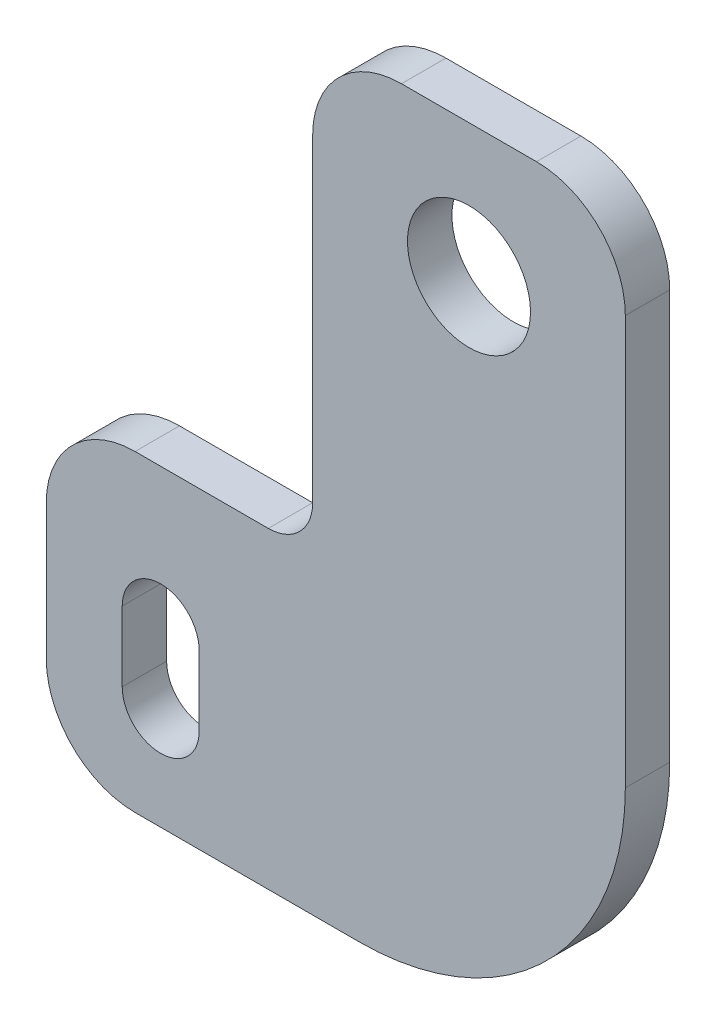
ISO-10303-21;
HEADER;
FILE_DESCRIPTION(('STEP AP214'),'2;1');
FILE_NAME('part.step','',(''),(''),'','','');
FILE_SCHEMA(('AUTOMOTIVE_DESIGN { 1 0 10303 214 1 1 1 1 }'));
ENDSEC;
DATA;
#1=APPLICATION_CONTEXT('core data for automotive mechanical design processes');
#2=APPLICATION_PROTOCOL_DEFINITION('international standard','automotive_design',2000,#1);
#3=PRODUCT_CONTEXT('',#1,'mechanical');
#4=PRODUCT('Part','Part','',(#3));
#5=PRODUCT_RELATED_PRODUCT_CATEGORY('part','',(#4));
#6=PRODUCT_DEFINITION_FORMATION('','',#4);
#7=PRODUCT_DEFINITION_CONTEXT('part definition',#1,'design');
#8=PRODUCT_DEFINITION('design','',#6,#7);
#9=PRODUCT_DEFINITION_SHAPE('','',#8);
#10=(LENGTH_UNIT() NAMED_UNIT(*) SI_UNIT(.MILLI.,.METRE.));
#11=(NAMED_UNIT(*) PLANE_ANGLE_UNIT() SI_UNIT($,.RADIAN.));
#12=(NAMED_UNIT(*) SI_UNIT($,.STERADIAN.) SOLID_ANGLE_UNIT());
#13=UNCERTAINTY_MEASURE_WITH_UNIT(LENGTH_MEASURE(1.E-05),#10,'distance_accuracy_value','');
#14=(GEOMETRIC_REPRESENTATION_CONTEXT(3) GLOBAL_UNCERTAINTY_ASSIGNED_CONTEXT((#13)) GLOBAL_UNIT_ASSIGNED_CONTEXT((#10,
#11,#12)) REPRESENTATION_CONTEXT('',''));
#15=CARTESIAN_POINT('',(0.,0.,0.));
#16=DIRECTION('',(0.,0.,1.));
#17=DIRECTION('',(1.,0.,0.));
#18=AXIS2_PLACEMENT_3D('',#15,#16,#17);
#19=CARTESIAN_POINT('',(0.,0.,-3.175));
#20=DIRECTION('',(-1.,0.,0.));
#21=DIRECTION('',(0.,0.,1.));
#22=AXIS2_PLACEMENT_3D('',#19,#20,#21);
#23=PLANE('',#22);
#24=DIRECTION('',(0.,-1.,0.));
#25=VECTOR('',#24,1.);
#26=CARTESIAN_POINT('',(0.,0.,-3.175));
#27=LINE('',#26,#25);
#28=CARTESIAN_POINT('',(0.,16.002,-3.175));
#29=VERTEX_POINT('',#28);
#30=CARTESIAN_POINT('',(0.,6.35,-3.175));
#31=VERTEX_POINT('',#30);
#32=EDGE_CURVE('E193',#29,#31,#27,.T.);
#33=ORIENTED_EDGE('',*,*,#32,.T.);
#34=DIRECTION('',(0.,0.,1.));
#35=VECTOR('',#34,1.);
#36=CARTESIAN_POINT('',(0.,6.35,-3.175));
#37=LINE('',#36,#35);
#38=CARTESIAN_POINT('',(0.,6.35,0.));
#39=VERTEX_POINT('',#38);
#40=EDGE_CURVE('E226',#31,#39,#37,.T.);
#41=ORIENTED_EDGE('',*,*,#40,.T.);
#42=DIRECTION('',(0.,-1.,0.));
#43=VECTOR('',#42,1.);
#44=CARTESIAN_POINT('',(0.,0.,0.));
#45=LINE('',#44,#43);
#46=CARTESIAN_POINT('',(0.,16.002,0.));
#47=VERTEX_POINT('',#46);
#48=EDGE_CURVE('E184',#47,#39,#45,.T.);
#49=ORIENTED_EDGE('',*,*,#48,.F.);
#50=DIRECTION('',(0.,0.,1.));
#51=VECTOR('',#50,1.);
#52=CARTESIAN_POINT('',(0.,16.002,-3.175));
#53=LINE('',#52,#51);
#54=EDGE_CURVE('E210',#47,#29,#53,.F.);
#55=ORIENTED_EDGE('',*,*,#54,.T.);
#56=EDGE_LOOP('',(#33,#41,#49,#55));
#57=FACE_BOUND('',#56,.T.);
#58=ADVANCED_FACE('F38',(#57),#23,.T.);
#59=CARTESIAN_POINT('',(0.,22.352,-3.175));
#60=DIRECTION('',(0.,1.,0.));
#61=DIRECTION('',(0.,0.,1.));
#62=AXIS2_PLACEMENT_3D('',#59,#60,#61);
#63=PLANE('',#62);
#64=DIRECTION('',(-1.,0.,0.));
#65=VECTOR('',#64,1.);
#66=CARTESIAN_POINT('',(0.,22.352,0.));
#67=LINE('',#66,#65);
#68=CARTESIAN_POINT('',(15.8708409647328,22.352,0.));
#69=VERTEX_POINT('',#68);
#70=CARTESIAN_POINT('',(6.35,22.352,0.));
#71=VERTEX_POINT('',#70);
#72=EDGE_CURVE('E197',#69,#71,#67,.T.);
#73=ORIENTED_EDGE('',*,*,#72,.F.);
#74=DIRECTION('',(0.,0.,1.));
#75=VECTOR('',#74,1.);
#76=CARTESIAN_POINT('',(15.8708409647328,22.352,-3.175));
#77=LINE('',#76,#75);
#78=CARTESIAN_POINT('',(15.8708409647328,22.352,-3.175));
#79=VERTEX_POINT('',#78);
#80=EDGE_CURVE('E274',#69,#79,#77,.F.);
#81=ORIENTED_EDGE('',*,*,#80,.T.);
#82=DIRECTION('',(-1.,0.,0.));
#83=VECTOR('',#82,1.);
#84=CARTESIAN_POINT('',(0.,22.352,-3.175));
#85=LINE('',#84,#83);
#86=CARTESIAN_POINT('',(6.35,22.352,-3.175));
#87=VERTEX_POINT('',#86);
#88=EDGE_CURVE('E208',#79,#87,#85,.T.);
#89=ORIENTED_EDGE('',*,*,#88,.T.);
#90=DIRECTION('',(0.,0.,1.));
#91=VECTOR('',#90,1.);
#92=CARTESIAN_POINT('',(6.35,22.352,-3.175));
#93=LINE('',#92,#91);
#94=EDGE_CURVE('E249',#87,#71,#93,.T.);
#95=ORIENTED_EDGE('',*,*,#94,.T.);
#96=EDGE_LOOP('',(#73,#81,#89,#95));
#97=FACE_BOUND('',#96,.T.);
#98=ADVANCED_FACE('F284',(#97),#63,.T.);
#99=CARTESIAN_POINT('',(19.0458409647328,54.6440071428529,-3.175));
#100=DIRECTION('',(-1.,0.,0.));
#101=DIRECTION('',(0.,-1.,0.));
#102=AXIS2_PLACEMENT_3D('',#99,#100,#101);
#103=PLANE('',#102);
#104=DIRECTION('',(0.,-1.,0.));
#105=VECTOR('',#104,1.);
#106=CARTESIAN_POINT('',(19.0458409647328,54.6440071428529,-3.175));
#107=LINE('',#106,#105);
#108=CARTESIAN_POINT('',(19.0458409647328,48.2940071428529,-3.175));
#109=VERTEX_POINT('',#108);
#110=CARTESIAN_POINT('',(19.0458409647328,25.527,-3.175));
#111=VERTEX_POINT('',#110);
#112=EDGE_CURVE('E205',#109,#111,#107,.T.);
#113=ORIENTED_EDGE('',*,*,#112,.T.);
#114=DIRECTION('',(0.,0.,1.));
#115=VECTOR('',#114,1.);
#116=CARTESIAN_POINT('',(19.0458409647328,25.527,0.));
#117=LINE('',#116,#115);
#118=CARTESIAN_POINT('',(19.0458409647328,25.527,0.));
#119=VERTEX_POINT('',#118);
#120=EDGE_CURVE('E271',#111,#119,#117,.T.);
#121=ORIENTED_EDGE('',*,*,#120,.T.);
#122=DIRECTION('',(0.,-1.,0.));
#123=VECTOR('',#122,1.);
#124=CARTESIAN_POINT('',(19.0458409647328,54.6440071428529,0.));
#125=LINE('',#124,#123);
#126=CARTESIAN_POINT('',(19.0458409647328,48.2940071428529,0.));
#127=VERTEX_POINT('',#126);
#128=EDGE_CURVE('E221',#127,#119,#125,.T.);
#129=ORIENTED_EDGE('',*,*,#128,.F.);
#130=DIRECTION('',(0.,0.,1.));
#131=VECTOR('',#130,1.);
#132=CARTESIAN_POINT('',(19.0458409647328,48.2940071428529,-3.175));
#133=LINE('',#132,#131);
#134=EDGE_CURVE('E257',#127,#109,#133,.F.);
#135=ORIENTED_EDGE('',*,*,#134,.T.);
#136=EDGE_LOOP('',(#113,#121,#129,#135));
#137=FACE_BOUND('',#136,.T.);
#138=ADVANCED_FACE('F293',(#137),#103,.T.);
#139=CARTESIAN_POINT('',(19.0458409647328,54.6440071428529,-3.175));
#140=DIRECTION('',(0.,1.,0.));
#141=DIRECTION('',(0.,0.,1.));
#142=AXIS2_PLACEMENT_3D('',#139,#140,#141);
#143=PLANE('',#142);
#144=DIRECTION('',(-1.,0.,0.));
#145=VECTOR('',#144,1.);
#146=CARTESIAN_POINT('',(19.0458409647328,54.6440071428529,-3.175));
#147=LINE('',#146,#145);
#148=CARTESIAN_POINT('',(35.0478409647328,54.6440071428529,-3.175));
#149=VERTEX_POINT('',#148);
#150=CARTESIAN_POINT('',(25.3958409647328,54.6440071428529,-3.175));
#151=VERTEX_POINT('',#150);
#152=EDGE_CURVE('E202',#149,#151,#147,.T.);
#153=ORIENTED_EDGE('',*,*,#152,.T.);
#154=DIRECTION('',(0.,0.,1.));
#155=VECTOR('',#154,1.);
#156=CARTESIAN_POINT('',(25.3958409647328,54.6440071428529,-3.175));
#157=LINE('',#156,#155);
#158=CARTESIAN_POINT('',(25.3958409647328,54.6440071428529,0.));
#159=VERTEX_POINT('',#158);
#160=EDGE_CURVE('E254',#151,#159,#157,.T.);
#161=ORIENTED_EDGE('',*,*,#160,.T.);
#162=DIRECTION('',(-1.,0.,0.));
#163=VECTOR('',#162,1.);
#164=CARTESIAN_POINT('',(19.0458409647328,54.6440071428529,0.));
#165=LINE('',#164,#163);
#166=CARTESIAN_POINT('',(35.0478409647328,54.6440071428529,0.));
#167=VERTEX_POINT('',#166);
#168=EDGE_CURVE('E218',#167,#159,#165,.T.);
#169=ORIENTED_EDGE('',*,*,#168,.F.);
#170=DIRECTION('',(0.,0.,1.));
#171=VECTOR('',#170,1.);
#172=CARTESIAN_POINT('',(35.0478409647328,54.6440071428529,-3.175));
#173=LINE('',#172,#171);
#174=EDGE_CURVE('E252',#167,#149,#173,.F.);
#175=ORIENTED_EDGE('',*,*,#174,.T.);
#176=EDGE_LOOP('',(#153,#161,#169,#175));
#177=FACE_BOUND('',#176,.T.);
#178=ADVANCED_FACE('F301',(#177),#143,.T.);
#179=CARTESIAN_POINT('',(41.3978409647328,54.6440071428529,-3.175));
#180=DIRECTION('',(1.,0.,0.));
#181=DIRECTION('',(0.,1.,0.));
#182=AXIS2_PLACEMENT_3D('',#179,#180,#181);
#183=PLANE('',#182);
#184=DIRECTION('',(0.,1.,0.));
#185=VECTOR('',#184,1.);
#186=CARTESIAN_POINT('',(41.3978409647328,54.6440071428529,0.));
#187=LINE('',#186,#185);
#188=CARTESIAN_POINT('',(41.3978409647328,19.05,0.));
#189=VERTEX_POINT('',#188);
#190=CARTESIAN_POINT('',(41.3978409647328,48.2940071428529,0.));
#191=VERTEX_POINT('',#190);
#192=EDGE_CURVE('E216',#189,#191,#187,.T.);
#193=ORIENTED_EDGE('',*,*,#192,.F.);
#194=DIRECTION('',(0.,0.,1.));
#195=VECTOR('',#194,1.);
#196=CARTESIAN_POINT('',(41.3978409647328,19.05,-3.175));
#197=LINE('',#196,#195);
#198=CARTESIAN_POINT('',(41.3978409647328,19.05,-3.175));
#199=VERTEX_POINT('',#198);
#200=EDGE_CURVE('E267',#189,#199,#197,.F.);
#201=ORIENTED_EDGE('',*,*,#200,.T.);
#202=DIRECTION('',(0.,1.,0.));
#203=VECTOR('',#202,1.);
#204=CARTESIAN_POINT('',(41.3978409647328,54.6440071428529,-3.175));
#205=LINE('',#204,#203);
#206=CARTESIAN_POINT('',(41.3978409647328,48.2940071428529,-3.175));
#207=VERTEX_POINT('',#206);
#208=EDGE_CURVE('E200',#199,#207,#205,.T.);
#209=ORIENTED_EDGE('',*,*,#208,.T.);
#210=DIRECTION('',(0.,0.,1.));
#211=VECTOR('',#210,1.);
#212=CARTESIAN_POINT('',(41.3978409647328,48.2940071428529,-3.175));
#213=LINE('',#212,#211);
#214=EDGE_CURVE('E259',#207,#191,#213,.T.);
#215=ORIENTED_EDGE('',*,*,#214,.T.);
#216=EDGE_LOOP('',(#193,#201,#209,#215));
#217=FACE_BOUND('',#216,.T.);
#218=ADVANCED_FACE('F348',(#217),#183,.T.);
#219=CARTESIAN_POINT('',(0.,0.,-3.175));
#220=DIRECTION('',(0.,-1.,0.));
#221=DIRECTION('',(0.,0.,-1.));
#222=AXIS2_PLACEMENT_3D('',#219,#220,#221);
#223=PLANE('',#222);
#224=DIRECTION('',(1.,0.,0.));
#225=VECTOR('',#224,1.);
#226=CARTESIAN_POINT('',(0.,0.,-3.175));
#227=LINE('',#226,#225);
#228=CARTESIAN_POINT('',(6.35,0.,-3.175));
#229=VERTEX_POINT('',#228);
#230=CARTESIAN_POINT('',(22.3478409647328,0.,-3.175));
#231=VERTEX_POINT('',#230);
#232=EDGE_CURVE('E196',#229,#231,#227,.T.);
#233=ORIENTED_EDGE('',*,*,#232,.T.);
#234=DIRECTION('',(0.,0.,1.));
#235=VECTOR('',#234,1.);
#236=CARTESIAN_POINT('',(22.3478409647328,0.,-3.175));
#237=LINE('',#236,#235);
#238=CARTESIAN_POINT('',(22.3478409647328,0.,0.));
#239=VERTEX_POINT('',#238);
#240=EDGE_CURVE('E262',#231,#239,#237,.T.);
#241=ORIENTED_EDGE('',*,*,#240,.T.);
#242=DIRECTION('',(1.,0.,0.));
#243=VECTOR('',#242,1.);
#244=CARTESIAN_POINT('',(0.,0.,0.));
#245=LINE('',#244,#243);
#246=CARTESIAN_POINT('',(6.35,0.,0.));
#247=VERTEX_POINT('',#246);
#248=EDGE_CURVE('E213',#247,#239,#245,.T.);
#249=ORIENTED_EDGE('',*,*,#248,.F.);
#250=DIRECTION('',(0.,0.,1.));
#251=VECTOR('',#250,1.);
#252=CARTESIAN_POINT('',(6.35,0.,-3.175));
#253=LINE('',#252,#251);
#254=EDGE_CURVE('E237',#247,#229,#253,.F.);
#255=ORIENTED_EDGE('',*,*,#254,.T.);
#256=EDGE_LOOP('',(#233,#241,#249,#255));
#257=FACE_BOUND('',#256,.T.);
#258=ADVANCED_FACE('F317',(#257),#223,.T.);
#259=CARTESIAN_POINT('',(0.,0.,-3.175));
#260=DIRECTION('',(0.,0.,-1.));
#261=DIRECTION('',(-1.,0.,0.));
#262=AXIS2_PLACEMENT_3D('',#259,#260,#261);
#263=PLANE('',#262);
#264=CARTESIAN_POINT('',(8.18094866968339,12.3250000000768,-3.175));
#265=DIRECTION('',(0.,0.,1.));
#266=DIRECTION('',(1.,0.,0.));
#267=AXIS2_PLACEMENT_3D('',#264,#265,#266);
#268=CIRCLE('',#267,2.75);
#269=CARTESIAN_POINT('',(10.9309486696834,12.3250000000768,-3.175));
#270=VERTEX_POINT('',#269);
#271=CARTESIAN_POINT('',(5.43094866968339,12.3250000000768,-3.175));
#272=VERTEX_POINT('',#271);
#273=EDGE_CURVE('E152',#270,#272,#268,.T.);
#274=ORIENTED_EDGE('',*,*,#273,.T.);
#275=DIRECTION('',(0.,-1.,0.));
#276=VECTOR('',#275,1.);
#277=CARTESIAN_POINT('',(5.43094866968341,7.32500000007682,-3.175));
#278=LINE('',#277,#276);
#279=CARTESIAN_POINT('',(5.43094866968341,7.32500000007682,-3.175));
#280=VERTEX_POINT('',#279);
#281=EDGE_CURVE('E161',#272,#280,#278,.T.);
#282=ORIENTED_EDGE('',*,*,#281,.T.);
#283=CARTESIAN_POINT('',(8.18094866968341,7.32500000007684,-3.175));
#284=DIRECTION('',(0.,0.,1.));
#285=DIRECTION('',(1.,0.,0.));
#286=AXIS2_PLACEMENT_3D('',#283,#284,#285);
#287=CIRCLE('',#286,2.75);
#288=CARTESIAN_POINT('',(10.9309486696834,7.32500000007683,-3.175));
#289=VERTEX_POINT('',#288);
#290=EDGE_CURVE('E53',#280,#289,#287,.T.);
#291=ORIENTED_EDGE('',*,*,#290,.T.);
#292=DIRECTION('',(0.,1.,0.));
#293=VECTOR('',#292,1.);
#294=CARTESIAN_POINT('',(10.9309486696834,12.3250000000768,-3.175));
#295=LINE('',#294,#293);
#296=EDGE_CURVE('E158',#289,#270,#295,.T.);
#297=ORIENTED_EDGE('',*,*,#296,.T.);
#298=EDGE_LOOP('',(#274,#282,#291,#297));
#299=FACE_BOUND('',#298,.T.);
#300=CARTESIAN_POINT('',(30.2218409647509,45.1190071428216,-3.175));
#301=DIRECTION('',(0.,0.,1.));
#302=DIRECTION('',(1.,0.,0.));
#303=AXIS2_PLACEMENT_3D('',#300,#301,#302);
#304=CIRCLE('',#303,4.39687500099185);
#305=CARTESIAN_POINT('',(34.6187159657428,45.1190071428216,-3.175));
#306=VERTEX_POINT('',#305);
#307=EDGE_CURVE('E178',#306,#306,#304,.T.);
#308=ORIENTED_EDGE('',*,*,#307,.T.);
#309=EDGE_LOOP('',(#308));
#310=FACE_BOUND('',#309,.T.);
#311=ORIENTED_EDGE('',*,*,#208,.F.);
#312=CARTESIAN_POINT('',(22.3478409647328,19.05,-3.175));
#313=DIRECTION('',(0.,0.,-1.));
#314=DIRECTION('',(-1.,0.,0.));
#315=AXIS2_PLACEMENT_3D('',#312,#313,#314);
#316=CIRCLE('',#315,19.05);
#317=EDGE_CURVE('E269',#199,#231,#316,.T.);
#318=ORIENTED_EDGE('',*,*,#317,.T.);
#319=ORIENTED_EDGE('',*,*,#232,.F.);
#320=CARTESIAN_POINT('',(6.35,6.35,-3.175));
#321=DIRECTION('',(0.,0.,-1.));
#322=DIRECTION('',(-1.,0.,0.));
#323=AXIS2_PLACEMENT_3D('',#320,#321,#322);
#324=CIRCLE('',#323,6.35);
#325=EDGE_CURVE('E247',#229,#31,#324,.T.);
#326=ORIENTED_EDGE('',*,*,#325,.T.);
#327=ORIENTED_EDGE('',*,*,#32,.F.);
#328=CARTESIAN_POINT('',(6.35,16.002,-3.175));
#329=DIRECTION('',(0.,0.,-1.));
#330=DIRECTION('',(-1.,0.,0.));
#331=AXIS2_PLACEMENT_3D('',#328,#329,#330);
#332=CIRCLE('',#331,6.35);
#333=EDGE_CURVE('E244',#29,#87,#332,.T.);
#334=ORIENTED_EDGE('',*,*,#333,.T.);
#335=ORIENTED_EDGE('',*,*,#88,.F.);
#336=CARTESIAN_POINT('',(15.8708409647328,25.527,-3.175));
#337=DIRECTION('',(0.,0.,-1.));
#338=DIRECTION('',(-1.,0.,0.));
#339=AXIS2_PLACEMENT_3D('',#336,#337,#338);
#340=CIRCLE('',#339,3.175);
#341=EDGE_CURVE('E11',#79,#111,#340,.F.);
#342=ORIENTED_EDGE('',*,*,#341,.T.);
#343=ORIENTED_EDGE('',*,*,#112,.F.);
#344=CARTESIAN_POINT('',(25.3958409647328,48.2940071428529,-3.175));
#345=DIRECTION('',(0.,0.,-1.));
#346=DIRECTION('',(-1.,0.,0.));
#347=AXIS2_PLACEMENT_3D('',#344,#345,#346);
#348=CIRCLE('',#347,6.35);
#349=EDGE_CURVE('E242',#109,#151,#348,.T.);
#350=ORIENTED_EDGE('',*,*,#349,.T.);
#351=ORIENTED_EDGE('',*,*,#152,.F.);
#352=CARTESIAN_POINT('',(35.0478409647328,48.2940071428529,-3.175));
#353=DIRECTION('',(0.,0.,-1.));
#354=DIRECTION('',(-1.,0.,0.));
#355=AXIS2_PLACEMENT_3D('',#352,#353,#354);
#356=CIRCLE('',#355,6.35);
#357=EDGE_CURVE('E239',#149,#207,#356,.T.);
#358=ORIENTED_EDGE('',*,*,#357,.T.);
#359=EDGE_LOOP('',(#311,#318,#319,#326,#327,#334,#335,#342,#343,#350,#351,#358));
#360=FACE_BOUND('',#359,.T.);
#361=ADVANCED_FACE('F165',(#299,#310,#360),#263,.T.);
#362=CARTESIAN_POINT('',(0.,0.,0.));
#363=DIRECTION('',(0.,0.,-1.));
#364=DIRECTION('',(-1.,0.,0.));
#365=AXIS2_PLACEMENT_3D('',#362,#363,#364);
#366=PLANE('',#365);
#367=DIRECTION('',(0.,-1.,0.));
#368=VECTOR('',#367,1.);
#369=CARTESIAN_POINT('',(5.43094866968341,7.32500000007682,0.));
#370=LINE('',#369,#368);
#371=CARTESIAN_POINT('',(5.43094866968339,12.3250000000768,0.));
#372=VERTEX_POINT('',#371);
#373=CARTESIAN_POINT('',(5.43094866968341,7.32500000007682,0.));
#374=VERTEX_POINT('',#373);
#375=EDGE_CURVE('E177',#372,#374,#370,.T.);
#376=ORIENTED_EDGE('',*,*,#375,.F.);
#377=CARTESIAN_POINT('',(8.18094866968339,12.3250000000768,0.));
#378=DIRECTION('',(0.,0.,1.));
#379=DIRECTION('',(1.,0.,0.));
#380=AXIS2_PLACEMENT_3D('',#377,#378,#379);
#381=CIRCLE('',#380,2.75);
#382=CARTESIAN_POINT('',(10.9309486696834,12.3250000000768,0.));
#383=VERTEX_POINT('',#382);
#384=EDGE_CURVE('E61',#383,#372,#381,.T.);
#385=ORIENTED_EDGE('',*,*,#384,.F.);
#386=DIRECTION('',(0.,1.,0.));
#387=VECTOR('',#386,1.);
#388=CARTESIAN_POINT('',(10.9309486696834,12.3250000000768,0.));
#389=LINE('',#388,#387);
#390=CARTESIAN_POINT('',(10.9309486696834,7.32500000007683,0.));
#391=VERTEX_POINT('',#390);
#392=EDGE_CURVE('E168',#391,#383,#389,.T.);
#393=ORIENTED_EDGE('',*,*,#392,.F.);
#394=CARTESIAN_POINT('',(8.18094866968341,7.32500000007684,0.));
#395=DIRECTION('',(0.,0.,1.));
#396=DIRECTION('',(1.,0.,0.));
#397=AXIS2_PLACEMENT_3D('',#394,#395,#396);
#398=CIRCLE('',#397,2.75);
#399=EDGE_CURVE('E171',#374,#391,#398,.T.);
#400=ORIENTED_EDGE('',*,*,#399,.F.);
#401=EDGE_LOOP('',(#376,#385,#393,#400));
#402=FACE_BOUND('',#401,.T.);
#403=CARTESIAN_POINT('',(30.2218409647509,45.1190071428216,0.));
#404=DIRECTION('',(0.,0.,1.));
#405=DIRECTION('',(1.,0.,0.));
#406=AXIS2_PLACEMENT_3D('',#403,#404,#405);
#407=CIRCLE('',#406,4.39687500099185);
#408=CARTESIAN_POINT('',(34.6187159657428,45.1190071428216,0.));
#409=VERTEX_POINT('',#408);
#410=EDGE_CURVE('E190',#409,#409,#407,.T.);
#411=ORIENTED_EDGE('',*,*,#410,.F.);
#412=EDGE_LOOP('',(#411));
#413=FACE_BOUND('',#412,.T.);
#414=ORIENTED_EDGE('',*,*,#248,.T.);
#415=CARTESIAN_POINT('',(22.3478409647328,19.05,0.));
#416=DIRECTION('',(0.,0.,-1.));
#417=DIRECTION('',(-1.,0.,0.));
#418=AXIS2_PLACEMENT_3D('',#415,#416,#417);
#419=CIRCLE('',#418,19.05);
#420=EDGE_CURVE('E265',#239,#189,#419,.F.);
#421=ORIENTED_EDGE('',*,*,#420,.T.);
#422=ORIENTED_EDGE('',*,*,#192,.T.);
#423=CARTESIAN_POINT('',(35.0478409647328,48.2940071428529,0.));
#424=DIRECTION('',(0.,0.,-1.));
#425=DIRECTION('',(-1.,0.,0.));
#426=AXIS2_PLACEMENT_3D('',#423,#424,#425);
#427=CIRCLE('',#426,6.35);
#428=EDGE_CURVE('E229',#191,#167,#427,.F.);
#429=ORIENTED_EDGE('',*,*,#428,.T.);
#430=ORIENTED_EDGE('',*,*,#168,.T.);
#431=CARTESIAN_POINT('',(25.3958409647328,48.2940071428529,0.));
#432=DIRECTION('',(0.,0.,-1.));
#433=DIRECTION('',(-1.,0.,0.));
#434=AXIS2_PLACEMENT_3D('',#431,#432,#433);
#435=CIRCLE('',#434,6.35);
#436=EDGE_CURVE('E231',#159,#127,#435,.F.);
#437=ORIENTED_EDGE('',*,*,#436,.T.);
#438=ORIENTED_EDGE('',*,*,#128,.T.);
#439=CARTESIAN_POINT('',(15.8708409647328,25.527,0.));
#440=DIRECTION('',(0.,0.,-1.));
#441=DIRECTION('',(-1.,0.,0.));
#442=AXIS2_PLACEMENT_3D('',#439,#440,#441);
#443=CIRCLE('',#442,3.175);
#444=EDGE_CURVE('E46',#119,#69,#443,.T.);
#445=ORIENTED_EDGE('',*,*,#444,.T.);
#446=ORIENTED_EDGE('',*,*,#72,.T.);
#447=CARTESIAN_POINT('',(6.35,16.002,0.));
#448=DIRECTION('',(0.,0.,-1.));
#449=DIRECTION('',(-1.,0.,0.));
#450=AXIS2_PLACEMENT_3D('',#447,#448,#449);
#451=CIRCLE('',#450,6.35);
#452=EDGE_CURVE('E233',#71,#47,#451,.F.);
#453=ORIENTED_EDGE('',*,*,#452,.T.);
#454=ORIENTED_EDGE('',*,*,#48,.T.);
#455=CARTESIAN_POINT('',(6.35,6.35,0.));
#456=DIRECTION('',(0.,0.,-1.));
#457=DIRECTION('',(-1.,0.,0.));
#458=AXIS2_PLACEMENT_3D('',#455,#456,#457);
#459=CIRCLE('',#458,6.35);
#460=EDGE_CURVE('E235',#39,#247,#459,.F.);
#461=ORIENTED_EDGE('',*,*,#460,.T.);
#462=EDGE_LOOP('',(#414,#421,#422,#429,#430,#437,#438,#445,#446,#453,#454,#461));
#463=FACE_BOUND('',#462,.T.);
#464=ADVANCED_FACE('F277',(#402,#413,#463),#366,.F.);
#465=CARTESIAN_POINT('',(6.35,6.35,-3.175));
#466=DIRECTION('',(0.,0.,1.));
#467=DIRECTION('',(1.,0.,0.));
#468=AXIS2_PLACEMENT_3D('',#465,#466,#467);
#469=CYLINDRICAL_SURFACE('',#468,6.35);
#470=ORIENTED_EDGE('',*,*,#325,.F.);
#471=ORIENTED_EDGE('',*,*,#254,.F.);
#472=ORIENTED_EDGE('',*,*,#460,.F.);
#473=ORIENTED_EDGE('',*,*,#40,.F.);
#474=EDGE_LOOP('',(#470,#471,#472,#473));
#475=FACE_BOUND('',#474,.T.);
#476=ADVANCED_FACE('F324',(#475),#469,.T.);
#477=CARTESIAN_POINT('',(6.35,16.002,-3.175));
#478=DIRECTION('',(0.,0.,1.));
#479=DIRECTION('',(1.,0.,0.));
#480=AXIS2_PLACEMENT_3D('',#477,#478,#479);
#481=CYLINDRICAL_SURFACE('',#480,6.35);
#482=ORIENTED_EDGE('',*,*,#333,.F.);
#483=ORIENTED_EDGE('',*,*,#54,.F.);
#484=ORIENTED_EDGE('',*,*,#452,.F.);
#485=ORIENTED_EDGE('',*,*,#94,.F.);
#486=EDGE_LOOP('',(#482,#483,#484,#485));
#487=FACE_BOUND('',#486,.T.);
#488=ADVANCED_FACE('F330',(#487),#481,.T.);
#489=CARTESIAN_POINT('',(25.3958409647328,48.2940071428529,-3.175));
#490=DIRECTION('',(0.,0.,1.));
#491=DIRECTION('',(1.,0.,0.));
#492=AXIS2_PLACEMENT_3D('',#489,#490,#491);
#493=CYLINDRICAL_SURFACE('',#492,6.35);
#494=ORIENTED_EDGE('',*,*,#349,.F.);
#495=ORIENTED_EDGE('',*,*,#134,.F.);
#496=ORIENTED_EDGE('',*,*,#436,.F.);
#497=ORIENTED_EDGE('',*,*,#160,.F.);
#498=EDGE_LOOP('',(#494,#495,#496,#497));
#499=FACE_BOUND('',#498,.T.);
#500=ADVANCED_FACE('F296',(#499),#493,.T.);
#501=CARTESIAN_POINT('',(35.0478409647328,48.2940071428529,-3.175));
#502=DIRECTION('',(0.,0.,1.));
#503=DIRECTION('',(1.,0.,0.));
#504=AXIS2_PLACEMENT_3D('',#501,#502,#503);
#505=CYLINDRICAL_SURFACE('',#504,6.35);
#506=ORIENTED_EDGE('',*,*,#357,.F.);
#507=ORIENTED_EDGE('',*,*,#174,.F.);
#508=ORIENTED_EDGE('',*,*,#428,.F.);
#509=ORIENTED_EDGE('',*,*,#214,.F.);
#510=EDGE_LOOP('',(#506,#507,#508,#509));
#511=FACE_BOUND('',#510,.T.);
#512=ADVANCED_FACE('F306',(#511),#505,.T.);
#513=CARTESIAN_POINT('',(22.3478409647328,19.05,-3.175));
#514=DIRECTION('',(0.,0.,1.));
#515=DIRECTION('',(1.,0.,0.));
#516=AXIS2_PLACEMENT_3D('',#513,#514,#515);
#517=CYLINDRICAL_SURFACE('',#516,19.05);
#518=ORIENTED_EDGE('',*,*,#317,.F.);
#519=ORIENTED_EDGE('',*,*,#200,.F.);
#520=ORIENTED_EDGE('',*,*,#420,.F.);
#521=ORIENTED_EDGE('',*,*,#240,.F.);
#522=EDGE_LOOP('',(#518,#519,#520,#521));
#523=FACE_BOUND('',#522,.T.);
#524=ADVANCED_FACE('F314',(#523),#517,.T.);
#525=CARTESIAN_POINT('',(15.8708409647328,25.527,-3.175));
#526=DIRECTION('',(0.,0.,-1.));
#527=DIRECTION('',(-1.,0.,0.));
#528=AXIS2_PLACEMENT_3D('',#525,#526,#527);
#529=CYLINDRICAL_SURFACE('',#528,3.175);
#530=ORIENTED_EDGE('',*,*,#341,.F.);
#531=ORIENTED_EDGE('',*,*,#80,.F.);
#532=ORIENTED_EDGE('',*,*,#444,.F.);
#533=ORIENTED_EDGE('',*,*,#120,.F.);
#534=EDGE_LOOP('',(#530,#531,#532,#533));
#535=FACE_BOUND('',#534,.T.);
#536=ADVANCED_FACE('F40',(#535),#529,.F.);
#537=CARTESIAN_POINT('',(30.2218409647509,45.1190071428216,-3.175));
#538=DIRECTION('',(0.,0.,1.));
#539=DIRECTION('',(1.,0.,0.));
#540=AXIS2_PLACEMENT_3D('',#537,#538,#539);
#541=CYLINDRICAL_SURFACE('',#540,4.39687500099185);
#542=ORIENTED_EDGE('',*,*,#307,.F.);
#543=EDGE_LOOP('',(#542));
#544=FACE_BOUND('',#543,.T.);
#545=ORIENTED_EDGE('',*,*,#410,.T.);
#546=EDGE_LOOP('',(#545));
#547=FACE_BOUND('',#546,.T.);
#548=ADVANCED_FACE('F360',(#544,#547),#541,.F.);
#549=CARTESIAN_POINT('',(8.18094866968339,12.3250000000768,-3.175));
#550=DIRECTION('',(0.,0.,1.));
#551=DIRECTION('',(1.,0.,0.));
#552=AXIS2_PLACEMENT_3D('',#549,#550,#551);
#553=CYLINDRICAL_SURFACE('',#552,2.75);
#554=ORIENTED_EDGE('',*,*,#384,.T.);
#555=DIRECTION('',(0.,0.,1.));
#556=VECTOR('',#555,1.);
#557=CARTESIAN_POINT('',(5.43094866968339,12.3250000000768,-3.175));
#558=LINE('',#557,#556);
#559=EDGE_CURVE('E148',#272,#372,#558,.T.);
#560=ORIENTED_EDGE('',*,*,#559,.F.);
#561=ORIENTED_EDGE('',*,*,#273,.F.);
#562=DIRECTION('',(0.,0.,1.));
#563=VECTOR('',#562,1.);
#564=CARTESIAN_POINT('',(10.9309486696834,12.3250000000768,-3.175));
#565=LINE('',#564,#563);
#566=EDGE_CURVE('E182',#270,#383,#565,.T.);
#567=ORIENTED_EDGE('',*,*,#566,.T.);
#568=EDGE_LOOP('',(#554,#560,#561,#567));
#569=FACE_BOUND('',#568,.T.);
#570=ADVANCED_FACE('F150',(#569),#553,.F.);
#571=CARTESIAN_POINT('',(10.9309486696834,12.3250000000768,-3.175));
#572=DIRECTION('',(1.,0.,0.));
#573=DIRECTION('',(0.,1.,0.));
#574=AXIS2_PLACEMENT_3D('',#571,#572,#573);
#575=PLANE('',#574);
#576=ORIENTED_EDGE('',*,*,#392,.T.);
#577=ORIENTED_EDGE('',*,*,#566,.F.);
#578=ORIENTED_EDGE('',*,*,#296,.F.);
#579=DIRECTION('',(0.,0.,1.));
#580=VECTOR('',#579,1.);
#581=CARTESIAN_POINT('',(10.9309486696834,7.32500000007683,-3.175));
#582=LINE('',#581,#580);
#583=EDGE_CURVE('E185',#289,#391,#582,.T.);
#584=ORIENTED_EDGE('',*,*,#583,.T.);
#585=EDGE_LOOP('',(#576,#577,#578,#584));
#586=FACE_BOUND('',#585,.T.);
#587=ADVANCED_FACE('F366',(#586),#575,.F.);
#588=CARTESIAN_POINT('',(8.18094866968341,7.32500000007684,-3.175));
#589=DIRECTION('',(0.,0.,1.));
#590=DIRECTION('',(1.,0.,0.));
#591=AXIS2_PLACEMENT_3D('',#588,#589,#590);
#592=CYLINDRICAL_SURFACE('',#591,2.75);
#593=ORIENTED_EDGE('',*,*,#399,.T.);
#594=ORIENTED_EDGE('',*,*,#583,.F.);
#595=ORIENTED_EDGE('',*,*,#290,.F.);
#596=DIRECTION('',(0.,0.,1.));
#597=VECTOR('',#596,1.);
#598=CARTESIAN_POINT('',(5.43094866968341,7.32500000007682,-3.175));
#599=LINE('',#598,#597);
#600=EDGE_CURVE('E157',#280,#374,#599,.T.);
#601=ORIENTED_EDGE('',*,*,#600,.T.);
#602=EDGE_LOOP('',(#593,#594,#595,#601));
#603=FACE_BOUND('',#602,.T.);
#604=ADVANCED_FACE('F369',(#603),#592,.F.);
#605=CARTESIAN_POINT('',(5.43094866968341,7.32500000007682,-3.175));
#606=DIRECTION('',(-1.,0.,0.));
#607=DIRECTION('',(0.,-1.,0.));
#608=AXIS2_PLACEMENT_3D('',#605,#606,#607);
#609=PLANE('',#608);
#610=ORIENTED_EDGE('',*,*,#375,.T.);
#611=ORIENTED_EDGE('',*,*,#600,.F.);
#612=ORIENTED_EDGE('',*,*,#281,.F.);
#613=ORIENTED_EDGE('',*,*,#559,.T.);
#614=EDGE_LOOP('',(#610,#611,#612,#613));
#615=FACE_BOUND('',#614,.T.);
#616=ADVANCED_FACE('F162',(#615),#609,.F.);
#617=CLOSED_SHELL('',(#58,#98,#138,#178,#218,#258,#361,#464,#476,#488,#500,#512,#524,#536,#548,
#570,#587,#604,#616));
#618=MANIFOLD_SOLID_BREP('B2',#617);
#619=ADVANCED_BREP_SHAPE_REPRESENTATION('',(#18,#618),#14);
#620=SHAPE_DEFINITION_REPRESENTATION(#9,#619);
ENDSEC;
END-ISO-10303-21;
